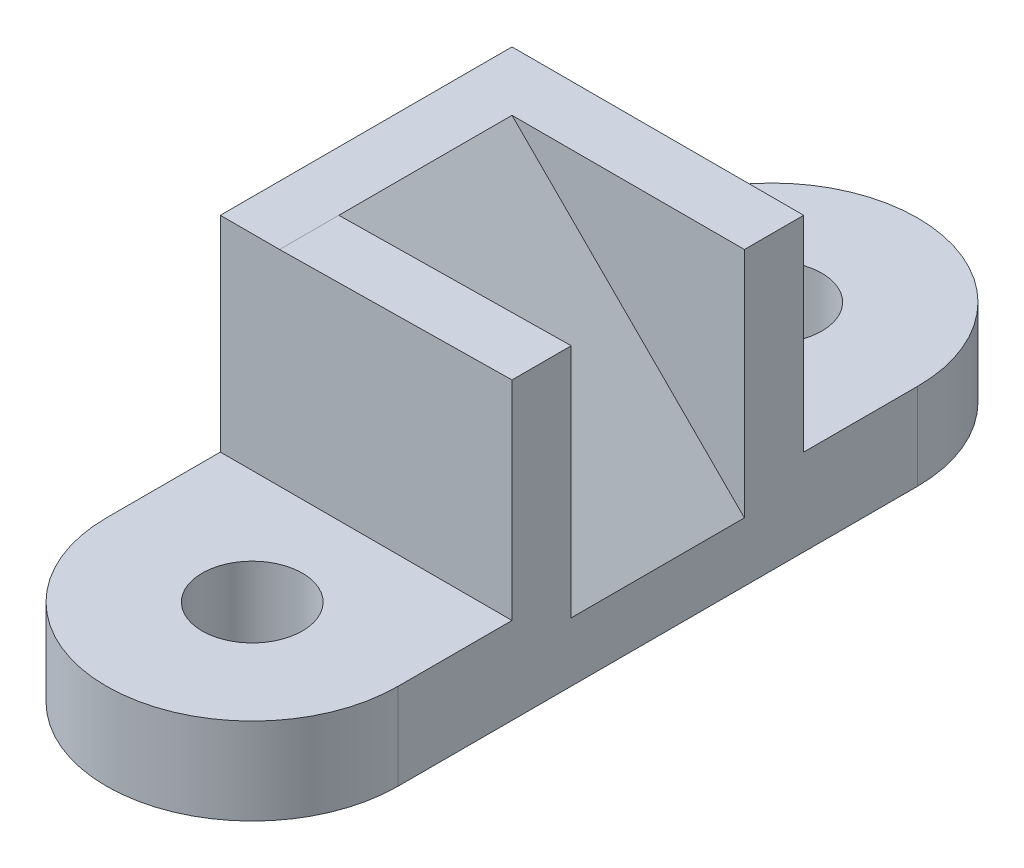
ISO-10303-21;
HEADER;
FILE_DESCRIPTION(('STEP AP214'),'2;1');
FILE_NAME('part.step','',(''),(''),'','','');
FILE_SCHEMA(('AUTOMOTIVE_DESIGN { 1 0 10303 214 1 1 1 1 }'));
ENDSEC;
DATA;
#1=APPLICATION_CONTEXT('core data for automotive mechanical design processes');
#2=APPLICATION_PROTOCOL_DEFINITION('international standard','automotive_design',2000,#1);
#3=PRODUCT_CONTEXT('',#1,'mechanical');
#4=PRODUCT('Part','Part','',(#3));
#5=PRODUCT_RELATED_PRODUCT_CATEGORY('part','',(#4));
#6=PRODUCT_DEFINITION_FORMATION('','',#4);
#7=PRODUCT_DEFINITION_CONTEXT('part definition',#1,'design');
#8=PRODUCT_DEFINITION('design','',#6,#7);
#9=PRODUCT_DEFINITION_SHAPE('','',#8);
#10=(LENGTH_UNIT() NAMED_UNIT(*) SI_UNIT(.MILLI.,.METRE.));
#11=(NAMED_UNIT(*) PLANE_ANGLE_UNIT() SI_UNIT($,.RADIAN.));
#12=(NAMED_UNIT(*) SI_UNIT($,.STERADIAN.) SOLID_ANGLE_UNIT());
#13=UNCERTAINTY_MEASURE_WITH_UNIT(LENGTH_MEASURE(1.E-05),#10,'distance_accuracy_value','');
#14=(GEOMETRIC_REPRESENTATION_CONTEXT(3) GLOBAL_UNCERTAINTY_ASSIGNED_CONTEXT((#13)) GLOBAL_UNIT_ASSIGNED_CONTEXT((#10,
#11,#12)) REPRESENTATION_CONTEXT('',''));
#15=CARTESIAN_POINT('',(0.,0.,0.));
#16=DIRECTION('',(0.,0.,1.));
#17=DIRECTION('',(1.,0.,0.));
#18=AXIS2_PLACEMENT_3D('',#15,#16,#17);
#19=CARTESIAN_POINT('',(0.,19.,-114.));
#20=DIRECTION('',(0.,1.,0.));
#21=DIRECTION('',(0.,0.,1.));
#22=AXIS2_PLACEMENT_3D('',#19,#20,#21);
#23=PLANE('',#22);
#24=DIRECTION('',(-1.,0.,0.));
#25=VECTOR('',#24,1.);
#26=CARTESIAN_POINT('',(-32.,19.,-89.));
#27=LINE('',#26,#25);
#28=CARTESIAN_POINT('',(32.,19.,-89.));
#29=VERTEX_POINT('',#28);
#30=CARTESIAN_POINT('',(-32.,19.,-89.));
#31=VERTEX_POINT('',#30);
#32=EDGE_CURVE('E64',#29,#31,#27,.T.);
#33=ORIENTED_EDGE('',*,*,#32,.F.);
#34=DIRECTION('',(0.,0.,-1.));
#35=VECTOR('',#34,1.);
#36=CARTESIAN_POINT('',(32.,19.,-114.));
#37=LINE('',#36,#35);
#38=CARTESIAN_POINT('',(32.,19.,-114.));
#39=VERTEX_POINT('',#38);
#40=EDGE_CURVE('E215',#29,#39,#37,.T.);
#41=ORIENTED_EDGE('',*,*,#40,.T.);
#42=CARTESIAN_POINT('',(0.,19.,-114.));
#43=DIRECTION('',(0.,1.,0.));
#44=DIRECTION('',(0.,0.,1.));
#45=AXIS2_PLACEMENT_3D('',#42,#43,#44);
#46=CIRCLE('',#45,32.);
#47=CARTESIAN_POINT('',(-32.,19.,-114.));
#48=VERTEX_POINT('',#47);
#49=EDGE_CURVE('E203',#39,#48,#46,.T.);
#50=ORIENTED_EDGE('',*,*,#49,.T.);
#51=DIRECTION('',(0.,0.,1.));
#52=VECTOR('',#51,1.);
#53=CARTESIAN_POINT('',(-32.,19.,-114.));
#54=LINE('',#53,#52);
#55=EDGE_CURVE('E209',#48,#31,#54,.T.);
#56=ORIENTED_EDGE('',*,*,#55,.T.);
#57=EDGE_LOOP('',(#33,#41,#50,#56));
#58=FACE_BOUND('',#57,.T.);
#59=CARTESIAN_POINT('',(0.,19.,-114.));
#60=DIRECTION('',(0.,1.,0.));
#61=DIRECTION('',(0.,0.,1.));
#62=AXIS2_PLACEMENT_3D('',#59,#60,#61);
#63=CIRCLE('',#62,11.);
#64=CARTESIAN_POINT('',(0.,19.,-103.));
#65=VERTEX_POINT('',#64);
#66=EDGE_CURVE('E190',#65,#65,#63,.T.);
#67=ORIENTED_EDGE('',*,*,#66,.F.);
#68=EDGE_LOOP('',(#67));
#69=FACE_BOUND('',#68,.T.);
#70=ADVANCED_FACE('F39',(#58,#69),#23,.T.);
#71=CARTESIAN_POINT('',(0.,19.,-114.));
#72=DIRECTION('',(0.,-1.,0.));
#73=DIRECTION('',(0.,0.,-1.));
#74=AXIS2_PLACEMENT_3D('',#71,#72,#73);
#75=CYLINDRICAL_SURFACE('',#74,32.);
#76=CARTESIAN_POINT('',(0.,0.,-114.));
#77=DIRECTION('',(0.,1.,0.));
#78=DIRECTION('',(0.,0.,1.));
#79=AXIS2_PLACEMENT_3D('',#76,#77,#78);
#80=CIRCLE('',#79,32.);
#81=CARTESIAN_POINT('',(32.,0.,-114.));
#82=VERTEX_POINT('',#81);
#83=CARTESIAN_POINT('',(-32.,0.,-114.));
#84=VERTEX_POINT('',#83);
#85=EDGE_CURVE('E198',#82,#84,#80,.T.);
#86=ORIENTED_EDGE('',*,*,#85,.T.);
#87=DIRECTION('',(0.,-1.,0.));
#88=VECTOR('',#87,1.);
#89=CARTESIAN_POINT('',(-32.,19.,-114.));
#90=LINE('',#89,#88);
#91=EDGE_CURVE('E11',#48,#84,#90,.T.);
#92=ORIENTED_EDGE('',*,*,#91,.F.);
#93=ORIENTED_EDGE('',*,*,#49,.F.);
#94=DIRECTION('',(0.,-1.,0.));
#95=VECTOR('',#94,1.);
#96=CARTESIAN_POINT('',(32.,19.,-114.));
#97=LINE('',#96,#95);
#98=EDGE_CURVE('E220',#39,#82,#97,.T.);
#99=ORIENTED_EDGE('',*,*,#98,.T.);
#100=EDGE_LOOP('',(#86,#92,#93,#99));
#101=FACE_BOUND('',#100,.T.);
#102=ADVANCED_FACE('F41',(#101),#75,.T.);
#103=CARTESIAN_POINT('',(-32.,19.,-114.));
#104=DIRECTION('',(1.,0.,0.));
#105=DIRECTION('',(0.,0.,-1.));
#106=AXIS2_PLACEMENT_3D('',#103,#104,#105);
#107=PLANE('',#106);
#108=DIRECTION('',(0.,0.,1.));
#109=VECTOR('',#108,1.);
#110=CARTESIAN_POINT('',(-32.,0.,-114.));
#111=LINE('',#110,#109);
#112=CARTESIAN_POINT('',(-32.,0.,0.));
#113=VERTEX_POINT('',#112);
#114=EDGE_CURVE('E224',#84,#113,#111,.T.);
#115=ORIENTED_EDGE('',*,*,#114,.T.);
#116=DIRECTION('',(0.,-1.,0.));
#117=VECTOR('',#116,1.);
#118=CARTESIAN_POINT('',(-32.,19.,0.));
#119=LINE('',#118,#117);
#120=CARTESIAN_POINT('',(-32.,19.,0.));
#121=VERTEX_POINT('',#120);
#122=EDGE_CURVE('E49',#121,#113,#119,.T.);
#123=ORIENTED_EDGE('',*,*,#122,.F.);
#124=CARTESIAN_POINT('',(-32.,19.,-25.));
#125=VERTEX_POINT('',#124);
#126=EDGE_CURVE('E207',#125,#121,#54,.T.);
#127=ORIENTED_EDGE('',*,*,#126,.F.);
#128=DIRECTION('',(0.,-1.,0.));
#129=VECTOR('',#128,1.);
#130=CARTESIAN_POINT('',(-32.,64.,-25.));
#131=LINE('',#130,#129);
#132=CARTESIAN_POINT('',(-32.,64.,-25.));
#133=VERTEX_POINT('',#132);
#134=EDGE_CURVE('E186',#133,#125,#131,.T.);
#135=ORIENTED_EDGE('',*,*,#134,.F.);
#136=DIRECTION('',(0.,0.,1.));
#137=VECTOR('',#136,1.);
#138=CARTESIAN_POINT('',(-32.,64.,-25.));
#139=LINE('',#138,#137);
#140=CARTESIAN_POINT('',(-32.,64.,-89.));
#141=VERTEX_POINT('',#140);
#142=EDGE_CURVE('E162',#141,#133,#139,.T.);
#143=ORIENTED_EDGE('',*,*,#142,.F.);
#144=DIRECTION('',(0.,-1.,0.));
#145=VECTOR('',#144,1.);
#146=CARTESIAN_POINT('',(-32.,64.,-89.));
#147=LINE('',#146,#145);
#148=EDGE_CURVE('E175',#141,#31,#147,.T.);
#149=ORIENTED_EDGE('',*,*,#148,.T.);
#150=ORIENTED_EDGE('',*,*,#55,.F.);
#151=ORIENTED_EDGE('',*,*,#91,.T.);
#152=EDGE_LOOP('',(#115,#123,#127,#135,#143,#149,#150,#151));
#153=FACE_BOUND('',#152,.T.);
#154=ADVANCED_FACE('F289',(#153),#107,.F.);
#155=CARTESIAN_POINT('',(0.,19.,0.));
#156=DIRECTION('',(0.,-1.,0.));
#157=DIRECTION('',(0.,0.,-1.));
#158=AXIS2_PLACEMENT_3D('',#155,#156,#157);
#159=CYLINDRICAL_SURFACE('',#158,32.);
#160=CARTESIAN_POINT('',(0.,0.,0.));
#161=DIRECTION('',(0.,1.,0.));
#162=DIRECTION('',(0.,0.,1.));
#163=AXIS2_PLACEMENT_3D('',#160,#161,#162);
#164=CIRCLE('',#163,32.);
#165=CARTESIAN_POINT('',(32.,0.,0.));
#166=VERTEX_POINT('',#165);
#167=EDGE_CURVE('E227',#113,#166,#164,.T.);
#168=ORIENTED_EDGE('',*,*,#167,.T.);
#169=DIRECTION('',(0.,-1.,0.));
#170=VECTOR('',#169,1.);
#171=CARTESIAN_POINT('',(32.,19.,0.));
#172=LINE('',#171,#170);
#173=CARTESIAN_POINT('',(32.,19.,0.));
#174=VERTEX_POINT('',#173);
#175=EDGE_CURVE('E235',#174,#166,#172,.T.);
#176=ORIENTED_EDGE('',*,*,#175,.F.);
#177=CARTESIAN_POINT('',(0.,19.,0.));
#178=DIRECTION('',(0.,1.,0.));
#179=DIRECTION('',(0.,0.,1.));
#180=AXIS2_PLACEMENT_3D('',#177,#178,#179);
#181=CIRCLE('',#180,32.);
#182=EDGE_CURVE('E212',#121,#174,#181,.T.);
#183=ORIENTED_EDGE('',*,*,#182,.F.);
#184=ORIENTED_EDGE('',*,*,#122,.T.);
#185=EDGE_LOOP('',(#168,#176,#183,#184));
#186=FACE_BOUND('',#185,.T.);
#187=ADVANCED_FACE('F245',(#186),#159,.T.);
#188=CARTESIAN_POINT('',(32.,19.,-114.));
#189=DIRECTION('',(-1.,0.,0.));
#190=DIRECTION('',(0.,0.,1.));
#191=AXIS2_PLACEMENT_3D('',#188,#189,#190);
#192=PLANE('',#191);
#193=DIRECTION('',(0.,0.,-1.));
#194=VECTOR('',#193,1.);
#195=CARTESIAN_POINT('',(32.,64.,-25.));
#196=LINE('',#195,#194);
#197=CARTESIAN_POINT('',(32.,64.,-76.));
#198=VERTEX_POINT('',#197);
#199=CARTESIAN_POINT('',(32.,64.,-89.));
#200=VERTEX_POINT('',#199);
#201=EDGE_CURVE('E170',#198,#200,#196,.T.);
#202=ORIENTED_EDGE('',*,*,#201,.F.);
#203=DIRECTION('',(0.,1.,0.));
#204=VECTOR('',#203,1.);
#205=CARTESIAN_POINT('',(32.,64.,-76.));
#206=LINE('',#205,#204);
#207=CARTESIAN_POINT('',(32.,13.,-76.));
#208=VERTEX_POINT('',#207);
#209=EDGE_CURVE('E56',#208,#198,#206,.T.);
#210=ORIENTED_EDGE('',*,*,#209,.F.);
#211=DIRECTION('',(0.,0.,1.));
#212=VECTOR('',#211,1.);
#213=CARTESIAN_POINT('',(32.,13.,-76.));
#214=LINE('',#213,#212);
#215=CARTESIAN_POINT('',(32.,13.,-38.));
#216=VERTEX_POINT('',#215);
#217=EDGE_CURVE('E143',#208,#216,#214,.T.);
#218=ORIENTED_EDGE('',*,*,#217,.T.);
#219=DIRECTION('',(0.,1.,0.));
#220=VECTOR('',#219,1.);
#221=CARTESIAN_POINT('',(32.,13.,-38.));
#222=LINE('',#221,#220);
#223=CARTESIAN_POINT('',(32.,64.7094372499062,-38.));
#224=VERTEX_POINT('',#223);
#225=EDGE_CURVE('E128',#216,#224,#222,.T.);
#226=ORIENTED_EDGE('',*,*,#225,.T.);
#227=DIRECTION('',(0.,0.,1.));
#228=VECTOR('',#227,1.);
#229=CARTESIAN_POINT('',(32.,64.7094372499062,-38.));
#230=LINE('',#229,#228);
#231=CARTESIAN_POINT('',(32.,64.7094372499062,-25.));
#232=VERTEX_POINT('',#231);
#233=EDGE_CURVE('E319',#224,#232,#230,.T.);
#234=ORIENTED_EDGE('',*,*,#233,.T.);
#235=DIRECTION('',(0.,1.,0.));
#236=VECTOR('',#235,1.);
#237=CARTESIAN_POINT('',(32.,13.,-25.));
#238=LINE('',#237,#236);
#239=CARTESIAN_POINT('',(32.,19.,-25.));
#240=VERTEX_POINT('',#239);
#241=EDGE_CURVE('E326',#240,#232,#238,.T.);
#242=ORIENTED_EDGE('',*,*,#241,.F.);
#243=EDGE_CURVE('E216',#174,#240,#37,.T.);
#244=ORIENTED_EDGE('',*,*,#243,.F.);
#245=ORIENTED_EDGE('',*,*,#175,.T.);
#246=DIRECTION('',(0.,0.,-1.));
#247=VECTOR('',#246,1.);
#248=CARTESIAN_POINT('',(32.,0.,-114.));
#249=LINE('',#248,#247);
#250=EDGE_CURVE('E208',#166,#82,#249,.T.);
#251=ORIENTED_EDGE('',*,*,#250,.T.);
#252=ORIENTED_EDGE('',*,*,#98,.F.);
#253=ORIENTED_EDGE('',*,*,#40,.F.);
#254=DIRECTION('',(0.,-1.,0.));
#255=VECTOR('',#254,1.);
#256=CARTESIAN_POINT('',(32.,64.,-89.));
#257=LINE('',#256,#255);
#258=EDGE_CURVE('E182',#200,#29,#257,.T.);
#259=ORIENTED_EDGE('',*,*,#258,.F.);
#260=EDGE_LOOP('',(#202,#210,#218,#226,#234,#242,#244,#245,#251,#252,#253,#259));
#261=FACE_BOUND('',#260,.T.);
#262=ADVANCED_FACE('F150',(#261),#192,.F.);
#263=DIRECTION('',(1.,0.,0.));
#264=VECTOR('',#263,1.);
#265=CARTESIAN_POINT('',(-32.,19.,-25.));
#266=LINE('',#265,#264);
#267=EDGE_CURVE('E152',#125,#240,#266,.T.);
#268=ORIENTED_EDGE('',*,*,#267,.F.);
#269=ORIENTED_EDGE('',*,*,#126,.T.);
#270=ORIENTED_EDGE('',*,*,#182,.T.);
#271=ORIENTED_EDGE('',*,*,#243,.T.);
#272=EDGE_LOOP('',(#268,#269,#270,#271));
#273=FACE_BOUND('',#272,.T.);
#274=CARTESIAN_POINT('',(0.,19.,0.));
#275=DIRECTION('',(0.,1.,0.));
#276=DIRECTION('',(0.,0.,1.));
#277=AXIS2_PLACEMENT_3D('',#274,#275,#276);
#278=CIRCLE('',#277,11.);
#279=CARTESIAN_POINT('',(0.,19.,11.));
#280=VERTEX_POINT('',#279);
#281=EDGE_CURVE('E199',#280,#280,#278,.T.);
#282=ORIENTED_EDGE('',*,*,#281,.F.);
#283=EDGE_LOOP('',(#282));
#284=FACE_BOUND('',#283,.T.);
#285=ADVANCED_FACE('F285',(#273,#284),#23,.T.);
#286=CARTESIAN_POINT('',(0.,0.,-114.));
#287=DIRECTION('',(0.,1.,0.));
#288=DIRECTION('',(0.,0.,1.));
#289=AXIS2_PLACEMENT_3D('',#286,#287,#288);
#290=PLANE('',#289);
#291=CARTESIAN_POINT('',(0.,0.,-114.));
#292=DIRECTION('',(0.,1.,0.));
#293=DIRECTION('',(0.,0.,1.));
#294=AXIS2_PLACEMENT_3D('',#291,#292,#293);
#295=CIRCLE('',#294,11.);
#296=CARTESIAN_POINT('',(0.,0.,-103.));
#297=VERTEX_POINT('',#296);
#298=EDGE_CURVE('E43',#297,#297,#295,.T.);
#299=ORIENTED_EDGE('',*,*,#298,.T.);
#300=EDGE_LOOP('',(#299));
#301=FACE_BOUND('',#300,.T.);
#302=CARTESIAN_POINT('',(0.,0.,0.));
#303=DIRECTION('',(0.,1.,0.));
#304=DIRECTION('',(0.,0.,1.));
#305=AXIS2_PLACEMENT_3D('',#302,#303,#304);
#306=CIRCLE('',#305,11.);
#307=CARTESIAN_POINT('',(0.,0.,11.));
#308=VERTEX_POINT('',#307);
#309=EDGE_CURVE('E194',#308,#308,#306,.T.);
#310=ORIENTED_EDGE('',*,*,#309,.T.);
#311=EDGE_LOOP('',(#310));
#312=FACE_BOUND('',#311,.T.);
#313=ORIENTED_EDGE('',*,*,#85,.F.);
#314=ORIENTED_EDGE('',*,*,#250,.F.);
#315=ORIENTED_EDGE('',*,*,#167,.F.);
#316=ORIENTED_EDGE('',*,*,#114,.F.);
#317=EDGE_LOOP('',(#313,#314,#315,#316));
#318=FACE_BOUND('',#317,.T.);
#319=ADVANCED_FACE('F252',(#301,#312,#318),#290,.F.);
#320=CARTESIAN_POINT('',(0.,0.,0.));
#321=DIRECTION('',(0.,1.,0.));
#322=DIRECTION('',(0.,0.,1.));
#323=AXIS2_PLACEMENT_3D('',#320,#321,#322);
#324=CYLINDRICAL_SURFACE('',#323,11.);
#325=ORIENTED_EDGE('',*,*,#309,.F.);
#326=EDGE_LOOP('',(#325));
#327=FACE_BOUND('',#326,.T.);
#328=ORIENTED_EDGE('',*,*,#281,.T.);
#329=EDGE_LOOP('',(#328));
#330=FACE_BOUND('',#329,.T.);
#331=ADVANCED_FACE('F271',(#327,#330),#324,.F.);
#332=CARTESIAN_POINT('',(0.,-402.999999999999,-114.));
#333=DIRECTION('',(0.,1.,0.));
#334=DIRECTION('',(0.,0.,1.));
#335=AXIS2_PLACEMENT_3D('',#332,#333,#334);
#336=CYLINDRICAL_SURFACE('',#335,11.);
#337=CARTESIAN_POINT('',(0.,19.,-103.));
#338=CARTESIAN_POINT('',(0.,18.8020833333333,-103.));
#339=CARTESIAN_POINT('',(0.,18.6041666666666,-103.));
#340=CARTESIAN_POINT('',(0.,18.2083333333333,-103.));
#341=CARTESIAN_POINT('',(0.,18.0104166666666,-103.));
#342=CARTESIAN_POINT('',(0.,17.6145833333333,-103.));
#343=CARTESIAN_POINT('',(0.,17.4166666666666,-103.));
#344=CARTESIAN_POINT('',(0.,17.0208333333333,-103.));
#345=CARTESIAN_POINT('',(0.,16.8229166666666,-103.));
#346=CARTESIAN_POINT('',(0.,16.4270833333333,-103.));
#347=CARTESIAN_POINT('',(0.,16.2291666666666,-103.));
#348=CARTESIAN_POINT('',(0.,15.8333333333333,-103.));
#349=CARTESIAN_POINT('',(0.,15.6354166666666,-103.));
#350=CARTESIAN_POINT('',(0.,15.2395833333333,-103.));
#351=CARTESIAN_POINT('',(0.,15.0416666666666,-103.));
#352=CARTESIAN_POINT('',(0.,14.6458333333333,-103.));
#353=CARTESIAN_POINT('',(0.,14.4479166666666,-103.));
#354=CARTESIAN_POINT('',(0.,14.0520833333333,-103.));
#355=CARTESIAN_POINT('',(0.,13.8541666666666,-103.));
#356=CARTESIAN_POINT('',(0.,13.4583333333333,-103.));
#357=CARTESIAN_POINT('',(0.,13.2604166666666,-103.));
#358=CARTESIAN_POINT('',(0.,12.8645833333333,-103.));
#359=CARTESIAN_POINT('',(0.,12.6666666666666,-103.));
#360=CARTESIAN_POINT('',(0.,12.2708333333333,-103.));
#361=CARTESIAN_POINT('',(0.,12.0729166666666,-103.));
#362=CARTESIAN_POINT('',(0.,11.6770833333333,-103.));
#363=CARTESIAN_POINT('',(0.,11.4791666666666,-103.));
#364=CARTESIAN_POINT('',(0.,11.0833333333333,-103.));
#365=CARTESIAN_POINT('',(0.,10.8854166666666,-103.));
#366=CARTESIAN_POINT('',(0.,10.4895833333333,-103.));
#367=CARTESIAN_POINT('',(0.,10.2916666666666,-103.));
#368=CARTESIAN_POINT('',(0.,9.89583333333329,-103.));
#369=CARTESIAN_POINT('',(0.,9.69791666666662,-103.));
#370=CARTESIAN_POINT('',(0.,9.30208333333329,-103.));
#371=CARTESIAN_POINT('',(0.,9.10416666666662,-103.));
#372=CARTESIAN_POINT('',(0.,8.70833333333328,-103.));
#373=CARTESIAN_POINT('',(0.,8.51041666666661,-103.));
#374=CARTESIAN_POINT('',(0.,8.11458333333328,-103.));
#375=CARTESIAN_POINT('',(0.,7.91666666666661,-103.));
#376=CARTESIAN_POINT('',(0.,7.52083333333327,-103.));
#377=CARTESIAN_POINT('',(0.,7.3229166666666,-103.));
#378=CARTESIAN_POINT('',(0.,6.92708333333327,-103.));
#379=CARTESIAN_POINT('',(0.,6.7291666666666,-103.));
#380=CARTESIAN_POINT('',(0.,6.33333333333326,-103.));
#381=CARTESIAN_POINT('',(0.,6.1354166666666,-103.));
#382=CARTESIAN_POINT('',(0.,5.73958333333326,-103.));
#383=CARTESIAN_POINT('',(0.,5.54166666666659,-103.));
#384=CARTESIAN_POINT('',(0.,5.14583333333328,-103.));
#385=CARTESIAN_POINT('',(0.,4.94791666666663,-103.));
#386=CARTESIAN_POINT('',(0.,4.55208333333331,-103.));
#387=CARTESIAN_POINT('',(0.,4.35416666666664,-103.));
#388=CARTESIAN_POINT('',(0.,3.9583333333333,-103.));
#389=CARTESIAN_POINT('',(0.,3.76041666666664,-103.));
#390=CARTESIAN_POINT('',(0.,3.3645833333333,-103.));
#391=CARTESIAN_POINT('',(0.,3.16666666666663,-103.));
#392=CARTESIAN_POINT('',(0.,2.7708333333333,-103.));
#393=CARTESIAN_POINT('',(0.,2.57291666666663,-103.));
#394=CARTESIAN_POINT('',(0.,2.17708333333329,-103.));
#395=CARTESIAN_POINT('',(0.,1.97916666666662,-103.));
#396=CARTESIAN_POINT('',(0.,1.58333333333329,-103.));
#397=CARTESIAN_POINT('',(0.,1.38541666666662,-103.));
#398=CARTESIAN_POINT('',(0.,0.989583333333285,-103.));
#399=CARTESIAN_POINT('',(0.,0.791666666666617,-103.));
#400=CARTESIAN_POINT('',(0.,0.39583333333328,-103.));
#401=CARTESIAN_POINT('',(0.,0.197916666666612,-103.));
#402=CARTESIAN_POINT('',(0.,0.,-103.));
#403=B_SPLINE_CURVE_WITH_KNOTS('',3,(#337,#338,#339,#340,#341,#342,#343,#344,#345,#346,#347,
#348,#349,#350,#351,#352,#353,#354,#355,#356,#357,#358,#359,#360,#361,#362,#363,#364,#365,#366,
#367,#368,#369,#370,#371,#372,#373,#374,#375,#376,#377,#378,#379,#380,#381,#382,#383,#384,#385,
#386,#387,#388,#389,#390,#391,#392,#393,#394,#395,#396,#397,#398,#399,#400,#401,#402),
.UNSPECIFIED.,.F.,.F.,(4,2,2,2,2,2,2,2,2,2,2,2,2,2,2,2,2,2,2,2,2,2,2,2,2,2,2,2,2,2,2,2,4),(0.,
0.593750000000004,1.18750000000001,1.78125000000001,2.37500000000002,2.96875000000002,
3.56250000000002,4.15625000000003,4.75000000000003,5.34374999999998,5.93749999999998,
6.53124999999999,7.12499999999999,7.71875,8.3125,8.90625,9.50000000000001,10.09375,10.6875,
11.28125,11.875,12.46875,13.0625,13.65625,14.25,14.84375,15.4375,16.03125,16.625,17.21875,
17.8125,18.40625,19.),.UNSPECIFIED.);
#404=EDGE_CURVE('BSEAM268',#65,#297,#403,.T.);
#405=ORIENTED_EDGE('',*,*,#66,.T.);
#406=ORIENTED_EDGE('',*,*,#298,.F.);
#407=ORIENTED_EDGE('',*,*,#404,.T.);
#408=ORIENTED_EDGE('',*,*,#404,.F.);
#409=EDGE_LOOP('',(#405,#407,#406,#408));
#410=FACE_BOUND('',#409,.T.);
#411=ADVANCED_FACE('F268',(#410),#336,.F.);
#412=CARTESIAN_POINT('',(-32.,64.,-25.));
#413=DIRECTION('',(0.,0.,-1.));
#414=DIRECTION('',(-1.,0.,0.));
#415=AXIS2_PLACEMENT_3D('',#412,#413,#414);
#416=PLANE('',#415);
#417=ORIENTED_EDGE('',*,*,#267,.T.);
#418=ORIENTED_EDGE('',*,*,#241,.T.);
#419=DIRECTION('',(-0.999903262556589,-0.0139091886423602,0.));
#420=VECTOR('',#419,1.);
#421=CARTESIAN_POINT('',(32.,64.7094372499062,-25.));
#422=LINE('',#421,#420);
#423=CARTESIAN_POINT('',(-19.,64.,-25.));
#424=VERTEX_POINT('',#423);
#425=EDGE_CURVE('E147',#232,#424,#422,.T.);
#426=ORIENTED_EDGE('',*,*,#425,.T.);
#427=DIRECTION('',(1.,0.,0.));
#428=VECTOR('',#427,1.);
#429=CARTESIAN_POINT('',(-32.,64.,-25.));
#430=LINE('',#429,#428);
#431=EDGE_CURVE('E166',#133,#424,#430,.T.);
#432=ORIENTED_EDGE('',*,*,#431,.F.);
#433=ORIENTED_EDGE('',*,*,#134,.T.);
#434=EDGE_LOOP('',(#417,#418,#426,#432,#433));
#435=FACE_BOUND('',#434,.T.);
#436=ADVANCED_FACE('F270',(#435),#416,.F.);
#437=CARTESIAN_POINT('',(-32.,64.,-89.));
#438=DIRECTION('',(0.,0.,1.));
#439=DIRECTION('',(1.,0.,0.));
#440=AXIS2_PLACEMENT_3D('',#437,#438,#439);
#441=PLANE('',#440);
#442=ORIENTED_EDGE('',*,*,#32,.T.);
#443=ORIENTED_EDGE('',*,*,#148,.F.);
#444=DIRECTION('',(-1.,0.,0.));
#445=VECTOR('',#444,1.);
#446=CARTESIAN_POINT('',(-32.,64.,-89.));
#447=LINE('',#446,#445);
#448=EDGE_CURVE('E173',#200,#141,#447,.T.);
#449=ORIENTED_EDGE('',*,*,#448,.F.);
#450=ORIENTED_EDGE('',*,*,#258,.T.);
#451=EDGE_LOOP('',(#442,#443,#449,#450));
#452=FACE_BOUND('',#451,.T.);
#453=ADVANCED_FACE('F278',(#452),#441,.F.);
#454=CARTESIAN_POINT('',(0.,64.,0.));
#455=DIRECTION('',(0.,-1.,0.));
#456=DIRECTION('',(0.,0.,-1.));
#457=AXIS2_PLACEMENT_3D('',#454,#455,#456);
#458=PLANE('',#457);
#459=ORIENTED_EDGE('',*,*,#431,.T.);
#460=DIRECTION('',(0.,0.,1.));
#461=VECTOR('',#460,1.);
#462=CARTESIAN_POINT('',(-19.,64.,-38.));
#463=LINE('',#462,#461);
#464=CARTESIAN_POINT('',(-19.,64.,-38.));
#465=VERTEX_POINT('',#464);
#466=EDGE_CURVE('E316',#465,#424,#463,.T.);
#467=ORIENTED_EDGE('',*,*,#466,.F.);
#468=DIRECTION('',(0.,0.,1.));
#469=VECTOR('',#468,1.);
#470=CARTESIAN_POINT('',(-19.,64.,-76.));
#471=LINE('',#470,#469);
#472=CARTESIAN_POINT('',(-19.,64.,-76.));
#473=VERTEX_POINT('',#472);
#474=EDGE_CURVE('E145',#473,#465,#471,.T.);
#475=ORIENTED_EDGE('',*,*,#474,.F.);
#476=DIRECTION('',(-1.,0.,0.));
#477=VECTOR('',#476,1.);
#478=CARTESIAN_POINT('',(32.,64.,-76.));
#479=LINE('',#478,#477);
#480=EDGE_CURVE('E312',#198,#473,#479,.T.);
#481=ORIENTED_EDGE('',*,*,#480,.F.);
#482=ORIENTED_EDGE('',*,*,#201,.T.);
#483=ORIENTED_EDGE('',*,*,#448,.T.);
#484=ORIENTED_EDGE('',*,*,#142,.T.);
#485=EDGE_LOOP('',(#459,#467,#475,#481,#482,#483,#484));
#486=FACE_BOUND('',#485,.T.);
#487=ADVANCED_FACE('F308',(#486),#458,.F.);
#488=CARTESIAN_POINT('',(-19.,64.,-76.));
#489=DIRECTION('',(-0.707106781186548,-0.707106781186548,0.));
#490=DIRECTION('',(0.707106781186548,-0.707106781186547,0.));
#491=AXIS2_PLACEMENT_3D('',#488,#489,#490);
#492=PLANE('',#491);
#493=ORIENTED_EDGE('',*,*,#474,.T.);
#494=DIRECTION('',(0.707106781186548,-0.707106781186548,0.));
#495=VECTOR('',#494,1.);
#496=CARTESIAN_POINT('',(-19.,64.,-38.));
#497=LINE('',#496,#495);
#498=EDGE_CURVE('E131',#465,#216,#497,.T.);
#499=ORIENTED_EDGE('',*,*,#498,.T.);
#500=ORIENTED_EDGE('',*,*,#217,.F.);
#501=DIRECTION('',(0.707106781186548,-0.707106781186548,0.));
#502=VECTOR('',#501,1.);
#503=CARTESIAN_POINT('',(-19.,64.,-76.));
#504=LINE('',#503,#502);
#505=EDGE_CURVE('E157',#473,#208,#504,.T.);
#506=ORIENTED_EDGE('',*,*,#505,.F.);
#507=EDGE_LOOP('',(#493,#499,#500,#506));
#508=FACE_BOUND('',#507,.T.);
#509=ADVANCED_FACE('F141',(#508),#492,.F.);
#510=CARTESIAN_POINT('',(0.,0.,-76.));
#511=DIRECTION('',(0.,0.,-1.));
#512=DIRECTION('',(-1.,0.,0.));
#513=AXIS2_PLACEMENT_3D('',#510,#511,#512);
#514=PLANE('',#513);
#515=ORIENTED_EDGE('',*,*,#209,.T.);
#516=ORIENTED_EDGE('',*,*,#480,.T.);
#517=ORIENTED_EDGE('',*,*,#505,.T.);
#518=EDGE_LOOP('',(#515,#516,#517));
#519=FACE_BOUND('',#518,.T.);
#520=ADVANCED_FACE('F333',(#519),#514,.F.);
#521=CARTESIAN_POINT('',(32.,64.7094372499062,-38.));
#522=DIRECTION('',(-0.0139091886423602,0.999903262556589,0.));
#523=DIRECTION('',(-0.999903262556589,-0.0139091886423602,0.));
#524=AXIS2_PLACEMENT_3D('',#521,#522,#523);
#525=PLANE('',#524);
#526=ORIENTED_EDGE('',*,*,#425,.F.);
#527=ORIENTED_EDGE('',*,*,#233,.F.);
#528=DIRECTION('',(-0.999903262556589,-0.0139091886423602,0.));
#529=VECTOR('',#528,1.);
#530=CARTESIAN_POINT('',(32.,64.7094372499062,-38.));
#531=LINE('',#530,#529);
#532=EDGE_CURVE('E133',#224,#465,#531,.T.);
#533=ORIENTED_EDGE('',*,*,#532,.T.);
#534=ORIENTED_EDGE('',*,*,#466,.T.);
#535=EDGE_LOOP('',(#526,#527,#533,#534));
#536=FACE_BOUND('',#535,.T.);
#537=ADVANCED_FACE('F331',(#536),#525,.T.);
#538=CARTESIAN_POINT('',(0.,0.,-38.));
#539=DIRECTION('',(0.,0.,-1.));
#540=DIRECTION('',(-1.,0.,0.));
#541=AXIS2_PLACEMENT_3D('',#538,#539,#540);
#542=PLANE('',#541);
#543=ORIENTED_EDGE('',*,*,#498,.F.);
#544=ORIENTED_EDGE('',*,*,#532,.F.);
#545=ORIENTED_EDGE('',*,*,#225,.F.);
#546=EDGE_LOOP('',(#543,#544,#545));
#547=FACE_BOUND('',#546,.T.);
#548=ADVANCED_FACE('F130',(#547),#542,.T.);
#549=CLOSED_SHELL('',(#70,#102,#154,#187,#262,#285,#319,#331,#411,#436,#453,#487,#509,#520,#537,#548));
#550=MANIFOLD_SOLID_BREP('B2',#549);
#551=ADVANCED_BREP_SHAPE_REPRESENTATION('',(#18,#550),#14);
#552=SHAPE_DEFINITION_REPRESENTATION(#9,#551);
ENDSEC;
END-ISO-10303-21;
